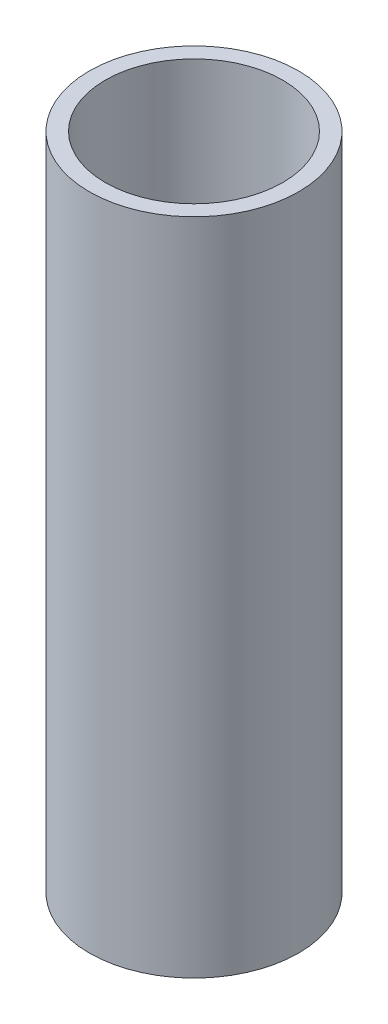
ISO-10303-21;
HEADER;
FILE_DESCRIPTION(('STEP AP214'),'2;1');
FILE_NAME('part.step','',(''),(''),'','','');
FILE_SCHEMA(('AUTOMOTIVE_DESIGN { 1 0 10303 214 1 1 1 1 }'));
ENDSEC;
DATA;
#1=APPLICATION_CONTEXT('core data for automotive mechanical design processes');
#2=APPLICATION_PROTOCOL_DEFINITION('international standard','automotive_design',2000,#1);
#3=PRODUCT_CONTEXT('',#1,'mechanical');
#4=PRODUCT('Part','Part','',(#3));
#5=PRODUCT_RELATED_PRODUCT_CATEGORY('part','',(#4));
#6=PRODUCT_DEFINITION_FORMATION('','',#4);
#7=PRODUCT_DEFINITION_CONTEXT('part definition',#1,'design');
#8=PRODUCT_DEFINITION('design','',#6,#7);
#9=PRODUCT_DEFINITION_SHAPE('','',#8);
#10=(LENGTH_UNIT() NAMED_UNIT(*) SI_UNIT(.MILLI.,.METRE.));
#11=(NAMED_UNIT(*) PLANE_ANGLE_UNIT() SI_UNIT($,.RADIAN.));
#12=(NAMED_UNIT(*) SI_UNIT($,.STERADIAN.) SOLID_ANGLE_UNIT());
#13=UNCERTAINTY_MEASURE_WITH_UNIT(LENGTH_MEASURE(1.E-05),#10,'distance_accuracy_value','');
#14=(GEOMETRIC_REPRESENTATION_CONTEXT(3) GLOBAL_UNCERTAINTY_ASSIGNED_CONTEXT((#13)) GLOBAL_UNIT_ASSIGNED_CONTEXT((#10,
#11,#12)) REPRESENTATION_CONTEXT('',''));
#15=CARTESIAN_POINT('',(0.,0.,0.));
#16=DIRECTION('',(0.,0.,1.));
#17=DIRECTION('',(1.,0.,0.));
#18=AXIS2_PLACEMENT_3D('',#15,#16,#17);
#19=CARTESIAN_POINT('',(0.,100.,0.));
#20=DIRECTION('',(0.,1.,0.));
#21=DIRECTION('',(0.,0.,1.));
#22=AXIS2_PLACEMENT_3D('',#19,#20,#21);
#23=PLANE('',#22);
#24=CARTESIAN_POINT('',(0.,100.,0.));
#25=DIRECTION('',(0.,1.,0.));
#26=DIRECTION('',(0.,0.,1.));
#27=AXIS2_PLACEMENT_3D('',#24,#25,#26);
#28=CIRCLE('',#27,15.875);
#29=CARTESIAN_POINT('',(0.,100.,15.875));
#30=VERTEX_POINT('',#29);
#31=EDGE_CURVE('E10',#30,#30,#28,.T.);
#32=ORIENTED_EDGE('',*,*,#31,.T.);
#33=EDGE_LOOP('',(#32));
#34=FACE_BOUND('',#33,.T.);
#35=CARTESIAN_POINT('',(0.,100.,0.));
#36=DIRECTION('',(0.,1.,0.));
#37=DIRECTION('',(0.,0.,1.));
#38=AXIS2_PLACEMENT_3D('',#35,#36,#37);
#39=CIRCLE('',#38,13.462);
#40=CARTESIAN_POINT('',(0.,100.,13.462));
#41=VERTEX_POINT('',#40);
#42=EDGE_CURVE('E42',#41,#41,#39,.T.);
#43=ORIENTED_EDGE('',*,*,#42,.F.);
#44=EDGE_LOOP('',(#43));
#45=FACE_BOUND('',#44,.T.);
#46=ADVANCED_FACE('F31',(#34,#45),#23,.T.);
#47=CARTESIAN_POINT('',(0.,0.,0.));
#48=DIRECTION('',(0.,1.,0.));
#49=DIRECTION('',(0.,0.,1.));
#50=AXIS2_PLACEMENT_3D('',#47,#48,#49);
#51=PLANE('',#50);
#52=CARTESIAN_POINT('',(0.,0.,0.));
#53=DIRECTION('',(0.,1.,0.));
#54=DIRECTION('',(0.,0.,1.));
#55=AXIS2_PLACEMENT_3D('',#52,#53,#54);
#56=CIRCLE('',#55,15.875);
#57=CARTESIAN_POINT('',(0.,0.,15.875));
#58=VERTEX_POINT('',#57);
#59=EDGE_CURVE('E35',#58,#58,#56,.T.);
#60=ORIENTED_EDGE('',*,*,#59,.F.);
#61=EDGE_LOOP('',(#60));
#62=FACE_BOUND('',#61,.T.);
#63=CARTESIAN_POINT('',(0.,0.,0.));
#64=DIRECTION('',(0.,1.,0.));
#65=DIRECTION('',(0.,0.,1.));
#66=AXIS2_PLACEMENT_3D('',#63,#64,#65);
#67=CIRCLE('',#66,13.462);
#68=CARTESIAN_POINT('',(0.,0.,13.462));
#69=VERTEX_POINT('',#68);
#70=EDGE_CURVE('E44',#69,#69,#67,.T.);
#71=ORIENTED_EDGE('',*,*,#70,.T.);
#72=EDGE_LOOP('',(#71));
#73=FACE_BOUND('',#72,.T.);
#74=ADVANCED_FACE('F54',(#62,#73),#51,.F.);
#75=CARTESIAN_POINT('',(0.,100.,0.));
#76=DIRECTION('',(0.,-1.,0.));
#77=DIRECTION('',(0.,0.,-1.));
#78=AXIS2_PLACEMENT_3D('',#75,#76,#77);
#79=CYLINDRICAL_SURFACE('',#78,15.875);
#80=ORIENTED_EDGE('',*,*,#31,.F.);
#81=EDGE_LOOP('',(#80));
#82=FACE_BOUND('',#81,.T.);
#83=ORIENTED_EDGE('',*,*,#59,.T.);
#84=EDGE_LOOP('',(#83));
#85=FACE_BOUND('',#84,.T.);
#86=ADVANCED_FACE('F33',(#82,#85),#79,.T.);
#87=CARTESIAN_POINT('',(0.,100.,0.));
#88=DIRECTION('',(0.,-1.,0.));
#89=DIRECTION('',(0.,0.,-1.));
#90=AXIS2_PLACEMENT_3D('',#87,#88,#89);
#91=CYLINDRICAL_SURFACE('',#90,13.462);
#92=ORIENTED_EDGE('',*,*,#42,.T.);
#93=EDGE_LOOP('',(#92));
#94=FACE_BOUND('',#93,.T.);
#95=ORIENTED_EDGE('',*,*,#70,.F.);
#96=EDGE_LOOP('',(#95));
#97=FACE_BOUND('',#96,.T.);
#98=ADVANCED_FACE('F50',(#94,#97),#91,.F.);
#99=CLOSED_SHELL('',(#46,#74,#86,#98));
#100=MANIFOLD_SOLID_BREP('B2',#99);
#101=ADVANCED_BREP_SHAPE_REPRESENTATION('',(#18,#100),#14);
#102=SHAPE_DEFINITION_REPRESENTATION(#9,#101);
ENDSEC;
END-ISO-10303-21;
